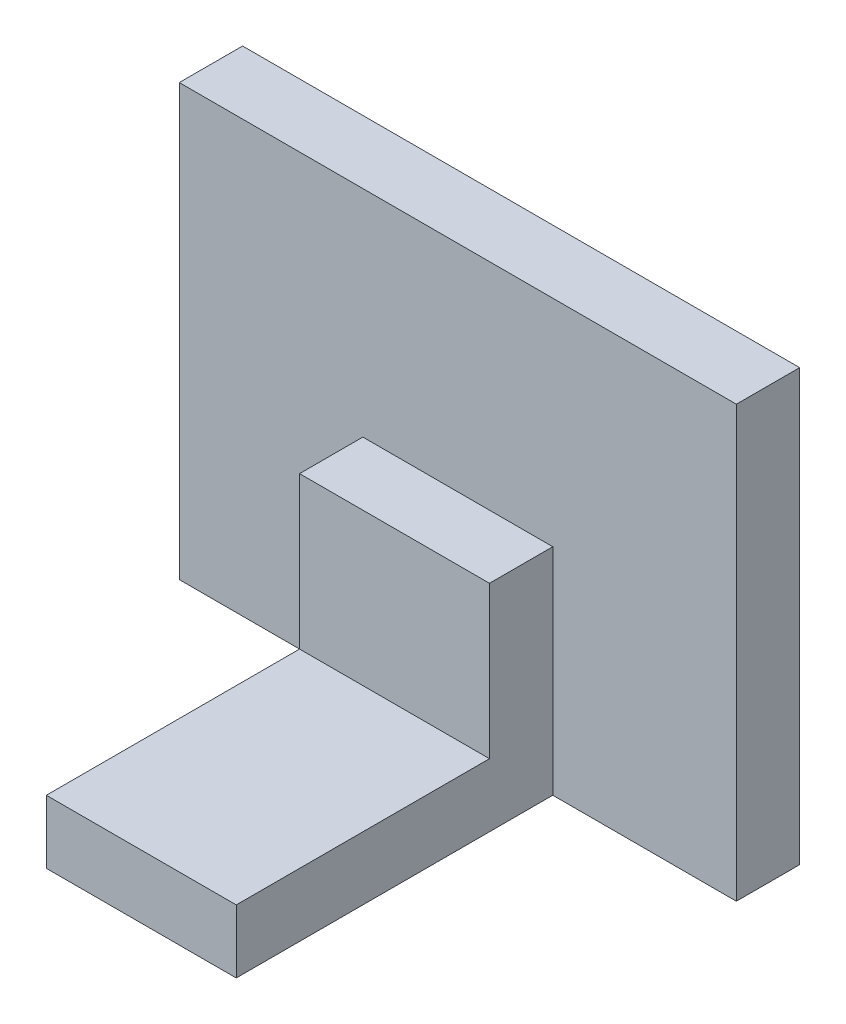
ISO-10303-21;
HEADER;
FILE_DESCRIPTION(('STEP AP214'),'2;1');
FILE_NAME('part.step','',(''),(''),'','','');
FILE_SCHEMA(('AUTOMOTIVE_DESIGN { 1 0 10303 214 1 1 1 1 }'));
ENDSEC;
DATA;
#1=APPLICATION_CONTEXT('core data for automotive mechanical design processes');
#2=APPLICATION_PROTOCOL_DEFINITION('international standard','automotive_design',2000,#1);
#3=PRODUCT_CONTEXT('',#1,'mechanical');
#4=PRODUCT('Part','Part','',(#3));
#5=PRODUCT_RELATED_PRODUCT_CATEGORY('part','',(#4));
#6=PRODUCT_DEFINITION_FORMATION('','',#4);
#7=PRODUCT_DEFINITION_CONTEXT('part definition',#1,'design');
#8=PRODUCT_DEFINITION('design','',#6,#7);
#9=PRODUCT_DEFINITION_SHAPE('','',#8);
#10=(LENGTH_UNIT() NAMED_UNIT(*) SI_UNIT(.MILLI.,.METRE.));
#11=(NAMED_UNIT(*) PLANE_ANGLE_UNIT() SI_UNIT($,.RADIAN.));
#12=(NAMED_UNIT(*) SI_UNIT($,.STERADIAN.) SOLID_ANGLE_UNIT());
#13=UNCERTAINTY_MEASURE_WITH_UNIT(LENGTH_MEASURE(1.E-05),#10,'distance_accuracy_value','');
#14=(GEOMETRIC_REPRESENTATION_CONTEXT(3) GLOBAL_UNCERTAINTY_ASSIGNED_CONTEXT((#13)) GLOBAL_UNIT_ASSIGNED_CONTEXT((#10,
#11,#12)) REPRESENTATION_CONTEXT('',''));
#15=CARTESIAN_POINT('',(0.,0.,0.));
#16=DIRECTION('',(0.,0.,1.));
#17=DIRECTION('',(1.,0.,0.));
#18=AXIS2_PLACEMENT_3D('',#15,#16,#17);
#19=CARTESIAN_POINT('',(0.,0.,0.));
#20=DIRECTION('',(0.,0.,1.));
#21=DIRECTION('',(1.,0.,0.));
#22=AXIS2_PLACEMENT_3D('',#19,#20,#21);
#23=PLANE('',#22);
#24=DIRECTION('',(1.,0.,0.));
#25=VECTOR('',#24,1.);
#26=CARTESIAN_POINT('',(-18.5,-13.,0.));
#27=LINE('',#26,#25);
#28=CARTESIAN_POINT('',(-18.5,-13.,0.));
#29=VERTEX_POINT('',#28);
#30=CARTESIAN_POINT('',(-11.5,-13.,0.));
#31=VERTEX_POINT('',#30);
#32=EDGE_CURVE('E228',#29,#31,#27,.T.);
#33=ORIENTED_EDGE('',*,*,#32,.T.);
#34=DIRECTION('',(0.,1.,0.));
#35=VECTOR('',#34,1.);
#36=CARTESIAN_POINT('',(-11.5,13.,0.));
#37=LINE('',#36,#35);
#38=CARTESIAN_POINT('',(-11.5,13.,0.));
#39=VERTEX_POINT('',#38);
#40=EDGE_CURVE('E168',#31,#39,#37,.T.);
#41=ORIENTED_EDGE('',*,*,#40,.T.);
#42=DIRECTION('',(-1.,0.,0.));
#43=VECTOR('',#42,1.);
#44=CARTESIAN_POINT('',(-18.5,13.,0.));
#45=LINE('',#44,#43);
#46=CARTESIAN_POINT('',(-18.5,13.,0.));
#47=VERTEX_POINT('',#46);
#48=EDGE_CURVE('E216',#39,#47,#45,.T.);
#49=ORIENTED_EDGE('',*,*,#48,.T.);
#50=DIRECTION('',(0.,-1.,0.));
#51=VECTOR('',#50,1.);
#52=CARTESIAN_POINT('',(-18.5,13.,0.));
#53=LINE('',#52,#51);
#54=EDGE_CURVE('E231',#47,#29,#53,.T.);
#55=ORIENTED_EDGE('',*,*,#54,.T.);
#56=EDGE_LOOP('',(#33,#41,#49,#55));
#57=FACE_BOUND('',#56,.T.);
#58=DIRECTION('',(0.,1.,0.));
#59=VECTOR('',#58,1.);
#60=CARTESIAN_POINT('',(22.,17.,0.));
#61=LINE('',#60,#59);
#62=CARTESIAN_POINT('',(22.,-17.,0.));
#63=VERTEX_POINT('',#62);
#64=CARTESIAN_POINT('',(22.,17.,0.));
#65=VERTEX_POINT('',#64);
#66=EDGE_CURVE('E277',#63,#65,#61,.T.);
#67=ORIENTED_EDGE('',*,*,#66,.F.);
#68=DIRECTION('',(1.,0.,0.));
#69=VECTOR('',#68,1.);
#70=CARTESIAN_POINT('',(-22.,-17.,0.));
#71=LINE('',#70,#69);
#72=CARTESIAN_POINT('',(-22.,-17.,0.));
#73=VERTEX_POINT('',#72);
#74=EDGE_CURVE('E282',#73,#63,#71,.T.);
#75=ORIENTED_EDGE('',*,*,#74,.F.);
#76=DIRECTION('',(0.,-1.,0.));
#77=VECTOR('',#76,1.);
#78=CARTESIAN_POINT('',(-22.,17.,0.));
#79=LINE('',#78,#77);
#80=CARTESIAN_POINT('',(-22.,17.,0.));
#81=VERTEX_POINT('',#80);
#82=EDGE_CURVE('E294',#81,#73,#79,.T.);
#83=ORIENTED_EDGE('',*,*,#82,.F.);
#84=DIRECTION('',(-1.,0.,0.));
#85=VECTOR('',#84,1.);
#86=CARTESIAN_POINT('',(-22.,17.,0.));
#87=LINE('',#86,#85);
#88=EDGE_CURVE('E292',#65,#81,#87,.T.);
#89=ORIENTED_EDGE('',*,*,#88,.F.);
#90=EDGE_LOOP('',(#67,#75,#83,#89));
#91=FACE_BOUND('',#90,.T.);
#92=DIRECTION('',(0.,1.,0.));
#93=VECTOR('',#92,1.);
#94=CARTESIAN_POINT('',(11.5,13.,0.));
#95=LINE('',#94,#93);
#96=CARTESIAN_POINT('',(11.5,-13.,0.));
#97=VERTEX_POINT('',#96);
#98=CARTESIAN_POINT('',(11.5,13.,0.));
#99=VERTEX_POINT('',#98);
#100=EDGE_CURVE('E244',#97,#99,#95,.T.);
#101=ORIENTED_EDGE('',*,*,#100,.F.);
#102=DIRECTION('',(-1.,0.,0.));
#103=VECTOR('',#102,1.);
#104=CARTESIAN_POINT('',(18.5,-13.,0.));
#105=LINE('',#104,#103);
#106=CARTESIAN_POINT('',(18.5,-13.,0.));
#107=VERTEX_POINT('',#106);
#108=EDGE_CURVE('E249',#107,#97,#105,.T.);
#109=ORIENTED_EDGE('',*,*,#108,.F.);
#110=DIRECTION('',(0.,-1.,0.));
#111=VECTOR('',#110,1.);
#112=CARTESIAN_POINT('',(18.5,13.,0.));
#113=LINE('',#112,#111);
#114=CARTESIAN_POINT('',(18.5,13.,0.));
#115=VERTEX_POINT('',#114);
#116=EDGE_CURVE('E261',#115,#107,#113,.T.);
#117=ORIENTED_EDGE('',*,*,#116,.F.);
#118=DIRECTION('',(1.,0.,0.));
#119=VECTOR('',#118,1.);
#120=CARTESIAN_POINT('',(18.5,13.,0.));
#121=LINE('',#120,#119);
#122=EDGE_CURVE('E258',#99,#115,#121,.T.);
#123=ORIENTED_EDGE('',*,*,#122,.F.);
#124=EDGE_LOOP('',(#101,#109,#117,#123));
#125=FACE_BOUND('',#124,.T.);
#126=ADVANCED_FACE('F34',(#57,#91,#125),#23,.F.);
#127=CARTESIAN_POINT('',(22.,17.,5.));
#128=DIRECTION('',(-1.,0.,0.));
#129=DIRECTION('',(0.,0.,1.));
#130=AXIS2_PLACEMENT_3D('',#127,#128,#129);
#131=PLANE('',#130);
#132=ORIENTED_EDGE('',*,*,#66,.T.);
#133=DIRECTION('',(0.,0.,-1.));
#134=VECTOR('',#133,1.);
#135=CARTESIAN_POINT('',(22.,17.,5.));
#136=LINE('',#135,#134);
#137=CARTESIAN_POINT('',(22.,17.,5.));
#138=VERTEX_POINT('',#137);
#139=EDGE_CURVE('E11',#138,#65,#136,.T.);
#140=ORIENTED_EDGE('',*,*,#139,.F.);
#141=DIRECTION('',(0.,1.,0.));
#142=VECTOR('',#141,1.);
#143=CARTESIAN_POINT('',(22.,17.,5.));
#144=LINE('',#143,#142);
#145=CARTESIAN_POINT('',(22.,-17.,5.));
#146=VERTEX_POINT('',#145);
#147=EDGE_CURVE('E278',#146,#138,#144,.T.);
#148=ORIENTED_EDGE('',*,*,#147,.F.);
#149=DIRECTION('',(0.,0.,-1.));
#150=VECTOR('',#149,1.);
#151=CARTESIAN_POINT('',(22.,-17.,5.));
#152=LINE('',#151,#150);
#153=EDGE_CURVE('E289',#146,#63,#152,.T.);
#154=ORIENTED_EDGE('',*,*,#153,.T.);
#155=EDGE_LOOP('',(#132,#140,#148,#154));
#156=FACE_BOUND('',#155,.T.);
#157=ADVANCED_FACE('F36',(#156),#131,.F.);
#158=CARTESIAN_POINT('',(-22.,17.,5.));
#159=DIRECTION('',(0.,-1.,0.));
#160=DIRECTION('',(0.,0.,-1.));
#161=AXIS2_PLACEMENT_3D('',#158,#159,#160);
#162=PLANE('',#161);
#163=ORIENTED_EDGE('',*,*,#88,.T.);
#164=DIRECTION('',(0.,0.,-1.));
#165=VECTOR('',#164,1.);
#166=CARTESIAN_POINT('',(-22.,17.,5.));
#167=LINE('',#166,#165);
#168=CARTESIAN_POINT('',(-22.,17.,5.));
#169=VERTEX_POINT('',#168);
#170=EDGE_CURVE('E42',#169,#81,#167,.T.);
#171=ORIENTED_EDGE('',*,*,#170,.F.);
#172=DIRECTION('',(-1.,0.,0.));
#173=VECTOR('',#172,1.);
#174=CARTESIAN_POINT('',(-22.,17.,5.));
#175=LINE('',#174,#173);
#176=EDGE_CURVE('E281',#138,#169,#175,.T.);
#177=ORIENTED_EDGE('',*,*,#176,.F.);
#178=ORIENTED_EDGE('',*,*,#139,.T.);
#179=EDGE_LOOP('',(#163,#171,#177,#178));
#180=FACE_BOUND('',#179,.T.);
#181=ADVANCED_FACE('F344',(#180),#162,.F.);
#182=CARTESIAN_POINT('',(-22.,17.,5.));
#183=DIRECTION('',(1.,0.,0.));
#184=DIRECTION('',(0.,0.,-1.));
#185=AXIS2_PLACEMENT_3D('',#182,#183,#184);
#186=PLANE('',#185);
#187=ORIENTED_EDGE('',*,*,#82,.T.);
#188=DIRECTION('',(0.,0.,-1.));
#189=VECTOR('',#188,1.);
#190=CARTESIAN_POINT('',(-22.,-17.,5.));
#191=LINE('',#190,#189);
#192=CARTESIAN_POINT('',(-22.,-17.,5.));
#193=VERTEX_POINT('',#192);
#194=EDGE_CURVE('E299',#193,#73,#191,.T.);
#195=ORIENTED_EDGE('',*,*,#194,.F.);
#196=DIRECTION('',(0.,-1.,0.));
#197=VECTOR('',#196,1.);
#198=CARTESIAN_POINT('',(-22.,17.,5.));
#199=LINE('',#198,#197);
#200=EDGE_CURVE('E284',#169,#193,#199,.T.);
#201=ORIENTED_EDGE('',*,*,#200,.F.);
#202=ORIENTED_EDGE('',*,*,#170,.T.);
#203=EDGE_LOOP('',(#187,#195,#201,#202));
#204=FACE_BOUND('',#203,.T.);
#205=ADVANCED_FACE('F306',(#204),#186,.F.);
#206=CARTESIAN_POINT('',(-22.,-17.,5.));
#207=DIRECTION('',(0.,1.,0.));
#208=DIRECTION('',(0.,0.,1.));
#209=AXIS2_PLACEMENT_3D('',#206,#207,#208);
#210=PLANE('',#209);
#211=ORIENTED_EDGE('',*,*,#74,.T.);
#212=ORIENTED_EDGE('',*,*,#153,.F.);
#213=DIRECTION('',(1.,0.,0.));
#214=VECTOR('',#213,1.);
#215=CARTESIAN_POINT('',(-22.,-17.,5.));
#216=LINE('',#215,#214);
#217=CARTESIAN_POINT('',(7.5,-17.,5.));
#218=VERTEX_POINT('',#217);
#219=EDGE_CURVE('E286',#218,#146,#216,.T.);
#220=ORIENTED_EDGE('',*,*,#219,.F.);
#221=DIRECTION('',(0.,0.,-1.));
#222=VECTOR('',#221,1.);
#223=CARTESIAN_POINT('',(7.5,-17.,10.));
#224=LINE('',#223,#222);
#225=CARTESIAN_POINT('',(7.5,-17.,30.));
#226=VERTEX_POINT('',#225);
#227=EDGE_CURVE('E169',#226,#218,#224,.T.);
#228=ORIENTED_EDGE('',*,*,#227,.F.);
#229=DIRECTION('',(1.,0.,0.));
#230=VECTOR('',#229,1.);
#231=CARTESIAN_POINT('',(-7.5,-17.,30.));
#232=LINE('',#231,#230);
#233=CARTESIAN_POINT('',(-7.5,-17.,30.));
#234=VERTEX_POINT('',#233);
#235=EDGE_CURVE('E172',#234,#226,#232,.T.);
#236=ORIENTED_EDGE('',*,*,#235,.F.);
#237=DIRECTION('',(0.,0.,-1.));
#238=VECTOR('',#237,1.);
#239=CARTESIAN_POINT('',(-7.5,-17.,10.));
#240=LINE('',#239,#238);
#241=CARTESIAN_POINT('',(-7.5,-17.,5.));
#242=VERTEX_POINT('',#241);
#243=EDGE_CURVE('E159',#234,#242,#240,.T.);
#244=ORIENTED_EDGE('',*,*,#243,.T.);
#245=EDGE_CURVE('E287',#193,#242,#216,.T.);
#246=ORIENTED_EDGE('',*,*,#245,.F.);
#247=ORIENTED_EDGE('',*,*,#194,.T.);
#248=EDGE_LOOP('',(#211,#212,#220,#228,#236,#244,#246,#247));
#249=FACE_BOUND('',#248,.T.);
#250=ADVANCED_FACE('F173',(#249),#210,.F.);
#251=CARTESIAN_POINT('',(0.,0.,5.));
#252=DIRECTION('',(0.,0.,1.));
#253=DIRECTION('',(1.,0.,0.));
#254=AXIS2_PLACEMENT_3D('',#251,#252,#253);
#255=PLANE('',#254);
#256=DIRECTION('',(0.,-1.,0.));
#257=VECTOR('',#256,1.);
#258=CARTESIAN_POINT('',(-7.5,0.,5.));
#259=LINE('',#258,#257);
#260=CARTESIAN_POINT('',(-7.5,0.,5.));
#261=VERTEX_POINT('',#260);
#262=EDGE_CURVE('E57',#261,#242,#259,.T.);
#263=ORIENTED_EDGE('',*,*,#262,.F.);
#264=DIRECTION('',(-1.,0.,0.));
#265=VECTOR('',#264,1.);
#266=CARTESIAN_POINT('',(-7.5,0.,5.));
#267=LINE('',#266,#265);
#268=CARTESIAN_POINT('',(7.5,0.,5.));
#269=VERTEX_POINT('',#268);
#270=EDGE_CURVE('E197',#269,#261,#267,.T.);
#271=ORIENTED_EDGE('',*,*,#270,.F.);
#272=DIRECTION('',(0.,1.,0.));
#273=VECTOR('',#272,1.);
#274=CARTESIAN_POINT('',(7.5,0.,5.));
#275=LINE('',#274,#273);
#276=EDGE_CURVE('E203',#218,#269,#275,.T.);
#277=ORIENTED_EDGE('',*,*,#276,.F.);
#278=ORIENTED_EDGE('',*,*,#219,.T.);
#279=ORIENTED_EDGE('',*,*,#147,.T.);
#280=ORIENTED_EDGE('',*,*,#176,.T.);
#281=ORIENTED_EDGE('',*,*,#200,.T.);
#282=ORIENTED_EDGE('',*,*,#245,.T.);
#283=EDGE_LOOP('',(#263,#271,#277,#278,#279,#280,#281,#282));
#284=FACE_BOUND('',#283,.T.);
#285=ADVANCED_FACE('F317',(#284),#255,.T.);
#286=CARTESIAN_POINT('',(11.5,13.,-1.));
#287=DIRECTION('',(1.,0.,0.));
#288=DIRECTION('',(0.,1.,0.));
#289=AXIS2_PLACEMENT_3D('',#286,#287,#288);
#290=PLANE('',#289);
#291=ORIENTED_EDGE('',*,*,#100,.T.);
#292=DIRECTION('',(0.,0.,1.));
#293=VECTOR('',#292,1.);
#294=CARTESIAN_POINT('',(11.5,13.,-1.));
#295=LINE('',#294,#293);
#296=CARTESIAN_POINT('',(11.5,13.,-1.));
#297=VERTEX_POINT('',#296);
#298=EDGE_CURVE('E274',#297,#99,#295,.T.);
#299=ORIENTED_EDGE('',*,*,#298,.F.);
#300=DIRECTION('',(0.,1.,0.));
#301=VECTOR('',#300,1.);
#302=CARTESIAN_POINT('',(11.5,13.,-1.));
#303=LINE('',#302,#301);
#304=CARTESIAN_POINT('',(11.5,-13.,-1.));
#305=VERTEX_POINT('',#304);
#306=EDGE_CURVE('E245',#305,#297,#303,.T.);
#307=ORIENTED_EDGE('',*,*,#306,.F.);
#308=DIRECTION('',(0.,0.,1.));
#309=VECTOR('',#308,1.);
#310=CARTESIAN_POINT('',(11.5,-13.,-1.));
#311=LINE('',#310,#309);
#312=EDGE_CURVE('E255',#305,#97,#311,.T.);
#313=ORIENTED_EDGE('',*,*,#312,.T.);
#314=EDGE_LOOP('',(#291,#299,#307,#313));
#315=FACE_BOUND('',#314,.T.);
#316=ADVANCED_FACE('F372',(#315),#290,.F.);
#317=CARTESIAN_POINT('',(18.5,13.,-1.));
#318=DIRECTION('',(0.,-1.,0.));
#319=DIRECTION('',(1.,0.,0.));
#320=AXIS2_PLACEMENT_3D('',#317,#318,#319);
#321=PLANE('',#320);
#322=ORIENTED_EDGE('',*,*,#122,.T.);
#323=DIRECTION('',(0.,0.,1.));
#324=VECTOR('',#323,1.);
#325=CARTESIAN_POINT('',(18.5,13.,-1.));
#326=LINE('',#325,#324);
#327=CARTESIAN_POINT('',(18.5,13.,-1.));
#328=VERTEX_POINT('',#327);
#329=EDGE_CURVE('E271',#328,#115,#326,.T.);
#330=ORIENTED_EDGE('',*,*,#329,.F.);
#331=DIRECTION('',(1.,0.,0.));
#332=VECTOR('',#331,1.);
#333=CARTESIAN_POINT('',(18.5,13.,-1.));
#334=LINE('',#333,#332);
#335=EDGE_CURVE('E248',#297,#328,#334,.T.);
#336=ORIENTED_EDGE('',*,*,#335,.F.);
#337=ORIENTED_EDGE('',*,*,#298,.T.);
#338=EDGE_LOOP('',(#322,#330,#336,#337));
#339=FACE_BOUND('',#338,.T.);
#340=ADVANCED_FACE('F378',(#339),#321,.F.);
#341=CARTESIAN_POINT('',(18.5,13.,-1.));
#342=DIRECTION('',(-1.,0.,0.));
#343=DIRECTION('',(0.,-1.,0.));
#344=AXIS2_PLACEMENT_3D('',#341,#342,#343);
#345=PLANE('',#344);
#346=ORIENTED_EDGE('',*,*,#116,.T.);
#347=DIRECTION('',(0.,0.,1.));
#348=VECTOR('',#347,1.);
#349=CARTESIAN_POINT('',(18.5,-13.,-1.));
#350=LINE('',#349,#348);
#351=CARTESIAN_POINT('',(18.5,-13.,-1.));
#352=VERTEX_POINT('',#351);
#353=EDGE_CURVE('E268',#352,#107,#350,.T.);
#354=ORIENTED_EDGE('',*,*,#353,.F.);
#355=DIRECTION('',(0.,-1.,0.));
#356=VECTOR('',#355,1.);
#357=CARTESIAN_POINT('',(18.5,13.,-1.));
#358=LINE('',#357,#356);
#359=EDGE_CURVE('E251',#328,#352,#358,.T.);
#360=ORIENTED_EDGE('',*,*,#359,.F.);
#361=ORIENTED_EDGE('',*,*,#329,.T.);
#362=EDGE_LOOP('',(#346,#354,#360,#361));
#363=FACE_BOUND('',#362,.T.);
#364=ADVANCED_FACE('F385',(#363),#345,.F.);
#365=CARTESIAN_POINT('',(18.5,-13.,-1.));
#366=DIRECTION('',(0.,1.,0.));
#367=DIRECTION('',(0.,0.,1.));
#368=AXIS2_PLACEMENT_3D('',#365,#366,#367);
#369=PLANE('',#368);
#370=ORIENTED_EDGE('',*,*,#108,.T.);
#371=ORIENTED_EDGE('',*,*,#312,.F.);
#372=DIRECTION('',(-1.,0.,0.));
#373=VECTOR('',#372,1.);
#374=CARTESIAN_POINT('',(18.5,-13.,-1.));
#375=LINE('',#374,#373);
#376=EDGE_CURVE('E253',#352,#305,#375,.T.);
#377=ORIENTED_EDGE('',*,*,#376,.F.);
#378=ORIENTED_EDGE('',*,*,#353,.T.);
#379=EDGE_LOOP('',(#370,#371,#377,#378));
#380=FACE_BOUND('',#379,.T.);
#381=ADVANCED_FACE('F393',(#380),#369,.F.);
#382=CARTESIAN_POINT('',(0.,0.,-1.));
#383=DIRECTION('',(0.,0.,-1.));
#384=DIRECTION('',(-1.,0.,0.));
#385=AXIS2_PLACEMENT_3D('',#382,#383,#384);
#386=PLANE('',#385);
#387=ORIENTED_EDGE('',*,*,#306,.T.);
#388=ORIENTED_EDGE('',*,*,#335,.T.);
#389=ORIENTED_EDGE('',*,*,#359,.T.);
#390=ORIENTED_EDGE('',*,*,#376,.T.);
#391=EDGE_LOOP('',(#387,#388,#389,#390));
#392=FACE_BOUND('',#391,.T.);
#393=ADVANCED_FACE('F401',(#392),#386,.T.);
#394=CARTESIAN_POINT('',(-11.5,13.,-1.));
#395=DIRECTION('',(1.,0.,0.));
#396=DIRECTION('',(0.,1.,0.));
#397=AXIS2_PLACEMENT_3D('',#394,#395,#396);
#398=PLANE('',#397);
#399=ORIENTED_EDGE('',*,*,#40,.F.);
#400=DIRECTION('',(0.,0.,1.));
#401=VECTOR('',#400,1.);
#402=CARTESIAN_POINT('',(-11.5,-13.,-1.));
#403=LINE('',#402,#401);
#404=CARTESIAN_POINT('',(-11.5,-13.,-1.));
#405=VERTEX_POINT('',#404);
#406=EDGE_CURVE('E242',#405,#31,#403,.T.);
#407=ORIENTED_EDGE('',*,*,#406,.F.);
#408=DIRECTION('',(0.,1.,0.));
#409=VECTOR('',#408,1.);
#410=CARTESIAN_POINT('',(-11.5,13.,-1.));
#411=LINE('',#410,#409);
#412=CARTESIAN_POINT('',(-11.5,13.,-1.));
#413=VERTEX_POINT('',#412);
#414=EDGE_CURVE('E212',#405,#413,#411,.T.);
#415=ORIENTED_EDGE('',*,*,#414,.T.);
#416=DIRECTION('',(0.,0.,1.));
#417=VECTOR('',#416,1.);
#418=CARTESIAN_POINT('',(-11.5,13.,-1.));
#419=LINE('',#418,#417);
#420=EDGE_CURVE('E225',#413,#39,#419,.T.);
#421=ORIENTED_EDGE('',*,*,#420,.T.);
#422=EDGE_LOOP('',(#399,#407,#415,#421));
#423=FACE_BOUND('',#422,.T.);
#424=ADVANCED_FACE('F409',(#423),#398,.T.);
#425=CARTESIAN_POINT('',(-18.5,-13.,-1.));
#426=DIRECTION('',(0.,-1.,0.));
#427=DIRECTION('',(0.,0.,-1.));
#428=AXIS2_PLACEMENT_3D('',#425,#426,#427);
#429=PLANE('',#428);
#430=ORIENTED_EDGE('',*,*,#32,.F.);
#431=DIRECTION('',(0.,0.,1.));
#432=VECTOR('',#431,1.);
#433=CARTESIAN_POINT('',(-18.5,-13.,-1.));
#434=LINE('',#433,#432);
#435=CARTESIAN_POINT('',(-18.5,-13.,-1.));
#436=VERTEX_POINT('',#435);
#437=EDGE_CURVE('E240',#436,#29,#434,.T.);
#438=ORIENTED_EDGE('',*,*,#437,.F.);
#439=DIRECTION('',(1.,0.,0.));
#440=VECTOR('',#439,1.);
#441=CARTESIAN_POINT('',(-18.5,-13.,-1.));
#442=LINE('',#441,#440);
#443=EDGE_CURVE('E215',#436,#405,#442,.T.);
#444=ORIENTED_EDGE('',*,*,#443,.T.);
#445=ORIENTED_EDGE('',*,*,#406,.T.);
#446=EDGE_LOOP('',(#430,#438,#444,#445));
#447=FACE_BOUND('',#446,.T.);
#448=ADVANCED_FACE('F417',(#447),#429,.T.);
#449=CARTESIAN_POINT('',(-18.5,13.,-1.));
#450=DIRECTION('',(-1.,0.,0.));
#451=DIRECTION('',(0.,-1.,0.));
#452=AXIS2_PLACEMENT_3D('',#449,#450,#451);
#453=PLANE('',#452);
#454=ORIENTED_EDGE('',*,*,#54,.F.);
#455=DIRECTION('',(0.,0.,1.));
#456=VECTOR('',#455,1.);
#457=CARTESIAN_POINT('',(-18.5,13.,-1.));
#458=LINE('',#457,#456);
#459=CARTESIAN_POINT('',(-18.5,13.,-1.));
#460=VERTEX_POINT('',#459);
#461=EDGE_CURVE('E237',#460,#47,#458,.T.);
#462=ORIENTED_EDGE('',*,*,#461,.F.);
#463=DIRECTION('',(0.,-1.,0.));
#464=VECTOR('',#463,1.);
#465=CARTESIAN_POINT('',(-18.5,13.,-1.));
#466=LINE('',#465,#464);
#467=EDGE_CURVE('E219',#460,#436,#466,.T.);
#468=ORIENTED_EDGE('',*,*,#467,.T.);
#469=ORIENTED_EDGE('',*,*,#437,.T.);
#470=EDGE_LOOP('',(#454,#462,#468,#469));
#471=FACE_BOUND('',#470,.T.);
#472=ADVANCED_FACE('F425',(#471),#453,.T.);
#473=CARTESIAN_POINT('',(-18.5,13.,-1.));
#474=DIRECTION('',(0.,1.,0.));
#475=DIRECTION('',(-1.,0.,0.));
#476=AXIS2_PLACEMENT_3D('',#473,#474,#475);
#477=PLANE('',#476);
#478=ORIENTED_EDGE('',*,*,#48,.F.);
#479=ORIENTED_EDGE('',*,*,#420,.F.);
#480=DIRECTION('',(-1.,0.,0.));
#481=VECTOR('',#480,1.);
#482=CARTESIAN_POINT('',(-18.5,13.,-1.));
#483=LINE('',#482,#481);
#484=EDGE_CURVE('E222',#413,#460,#483,.T.);
#485=ORIENTED_EDGE('',*,*,#484,.T.);
#486=ORIENTED_EDGE('',*,*,#461,.T.);
#487=EDGE_LOOP('',(#478,#479,#485,#486));
#488=FACE_BOUND('',#487,.T.);
#489=ADVANCED_FACE('F433',(#488),#477,.T.);
#490=CARTESIAN_POINT('',(0.,0.,-1.));
#491=DIRECTION('',(0.,0.,-1.));
#492=DIRECTION('',(1.,0.,0.));
#493=AXIS2_PLACEMENT_3D('',#490,#491,#492);
#494=PLANE('',#493);
#495=ORIENTED_EDGE('',*,*,#414,.F.);
#496=ORIENTED_EDGE('',*,*,#443,.F.);
#497=ORIENTED_EDGE('',*,*,#467,.F.);
#498=ORIENTED_EDGE('',*,*,#484,.F.);
#499=EDGE_LOOP('',(#495,#496,#497,#498));
#500=FACE_BOUND('',#499,.T.);
#501=ADVANCED_FACE('F441',(#500),#494,.T.);
#502=CARTESIAN_POINT('',(-7.5,0.,10.));
#503=DIRECTION('',(1.,0.,0.));
#504=DIRECTION('',(0.,1.,0.));
#505=AXIS2_PLACEMENT_3D('',#502,#503,#504);
#506=PLANE('',#505);
#507=ORIENTED_EDGE('',*,*,#262,.T.);
#508=ORIENTED_EDGE('',*,*,#243,.F.);
#509=DIRECTION('',(0.,-1.,0.));
#510=VECTOR('',#509,1.);
#511=CARTESIAN_POINT('',(-7.5,-17.,30.));
#512=LINE('',#511,#510);
#513=CARTESIAN_POINT('',(-7.5,-12.,30.));
#514=VERTEX_POINT('',#513);
#515=EDGE_CURVE('E164',#514,#234,#512,.T.);
#516=ORIENTED_EDGE('',*,*,#515,.F.);
#517=DIRECTION('',(0.,0.,-1.));
#518=VECTOR('',#517,1.);
#519=CARTESIAN_POINT('',(-7.5,-12.,30.));
#520=LINE('',#519,#518);
#521=CARTESIAN_POINT('',(-7.5,-12.,10.));
#522=VERTEX_POINT('',#521);
#523=EDGE_CURVE('E188',#514,#522,#520,.T.);
#524=ORIENTED_EDGE('',*,*,#523,.T.);
#525=DIRECTION('',(0.,-1.,0.));
#526=VECTOR('',#525,1.);
#527=CARTESIAN_POINT('',(-7.5,0.,10.));
#528=LINE('',#527,#526);
#529=CARTESIAN_POINT('',(-7.5,0.,10.));
#530=VERTEX_POINT('',#529);
#531=EDGE_CURVE('E194',#530,#522,#528,.T.);
#532=ORIENTED_EDGE('',*,*,#531,.F.);
#533=DIRECTION('',(0.,0.,-1.));
#534=VECTOR('',#533,1.);
#535=CARTESIAN_POINT('',(-7.5,0.,10.));
#536=LINE('',#535,#534);
#537=EDGE_CURVE('E201',#530,#261,#536,.T.);
#538=ORIENTED_EDGE('',*,*,#537,.T.);
#539=EDGE_LOOP('',(#507,#508,#516,#524,#532,#538));
#540=FACE_BOUND('',#539,.T.);
#541=ADVANCED_FACE('F161',(#540),#506,.F.);
#542=CARTESIAN_POINT('',(7.5,0.,10.));
#543=DIRECTION('',(-1.,0.,0.));
#544=DIRECTION('',(0.,-1.,0.));
#545=AXIS2_PLACEMENT_3D('',#542,#543,#544);
#546=PLANE('',#545);
#547=ORIENTED_EDGE('',*,*,#276,.T.);
#548=DIRECTION('',(0.,0.,-1.));
#549=VECTOR('',#548,1.);
#550=CARTESIAN_POINT('',(7.5,0.,10.));
#551=LINE('',#550,#549);
#552=CARTESIAN_POINT('',(7.5,0.,10.));
#553=VERTEX_POINT('',#552);
#554=EDGE_CURVE('E208',#553,#269,#551,.T.);
#555=ORIENTED_EDGE('',*,*,#554,.F.);
#556=DIRECTION('',(0.,1.,0.));
#557=VECTOR('',#556,1.);
#558=CARTESIAN_POINT('',(7.5,0.,10.));
#559=LINE('',#558,#557);
#560=CARTESIAN_POINT('',(7.5,-12.,10.));
#561=VERTEX_POINT('',#560);
#562=EDGE_CURVE('E196',#561,#553,#559,.T.);
#563=ORIENTED_EDGE('',*,*,#562,.F.);
#564=DIRECTION('',(0.,0.,-1.));
#565=VECTOR('',#564,1.);
#566=CARTESIAN_POINT('',(7.5,-12.,30.));
#567=LINE('',#566,#565);
#568=CARTESIAN_POINT('',(7.5,-12.,30.));
#569=VERTEX_POINT('',#568);
#570=EDGE_CURVE('E191',#569,#561,#567,.T.);
#571=ORIENTED_EDGE('',*,*,#570,.F.);
#572=DIRECTION('',(0.,1.,0.));
#573=VECTOR('',#572,1.);
#574=CARTESIAN_POINT('',(7.5,-17.,30.));
#575=LINE('',#574,#573);
#576=EDGE_CURVE('E178',#226,#569,#575,.T.);
#577=ORIENTED_EDGE('',*,*,#576,.F.);
#578=ORIENTED_EDGE('',*,*,#227,.T.);
#579=EDGE_LOOP('',(#547,#555,#563,#571,#577,#578));
#580=FACE_BOUND('',#579,.T.);
#581=ADVANCED_FACE('F319',(#580),#546,.F.);
#582=CARTESIAN_POINT('',(-7.5,0.,10.));
#583=DIRECTION('',(0.,-1.,0.));
#584=DIRECTION('',(0.,0.,-1.));
#585=AXIS2_PLACEMENT_3D('',#582,#583,#584);
#586=PLANE('',#585);
#587=ORIENTED_EDGE('',*,*,#270,.T.);
#588=ORIENTED_EDGE('',*,*,#537,.F.);
#589=DIRECTION('',(-1.,0.,0.));
#590=VECTOR('',#589,1.);
#591=CARTESIAN_POINT('',(-7.5,0.,10.));
#592=LINE('',#591,#590);
#593=EDGE_CURVE('E199',#553,#530,#592,.T.);
#594=ORIENTED_EDGE('',*,*,#593,.F.);
#595=ORIENTED_EDGE('',*,*,#554,.T.);
#596=EDGE_LOOP('',(#587,#588,#594,#595));
#597=FACE_BOUND('',#596,.T.);
#598=ADVANCED_FACE('F329',(#597),#586,.F.);
#599=CARTESIAN_POINT('',(0.,0.,10.));
#600=DIRECTION('',(0.,0.,1.));
#601=DIRECTION('',(1.,0.,0.));
#602=AXIS2_PLACEMENT_3D('',#599,#600,#601);
#603=PLANE('',#602);
#604=DIRECTION('',(-1.,0.,0.));
#605=VECTOR('',#604,1.);
#606=CARTESIAN_POINT('',(-7.5,-12.,10.));
#607=LINE('',#606,#605);
#608=EDGE_CURVE('E49',#561,#522,#607,.T.);
#609=ORIENTED_EDGE('',*,*,#608,.F.);
#610=ORIENTED_EDGE('',*,*,#562,.T.);
#611=ORIENTED_EDGE('',*,*,#593,.T.);
#612=ORIENTED_EDGE('',*,*,#531,.T.);
#613=EDGE_LOOP('',(#609,#610,#611,#612));
#614=FACE_BOUND('',#613,.T.);
#615=ADVANCED_FACE('F326',(#614),#603,.T.);
#616=CARTESIAN_POINT('',(-7.5,-12.,30.));
#617=DIRECTION('',(0.,-1.,0.));
#618=DIRECTION('',(0.,0.,-1.));
#619=AXIS2_PLACEMENT_3D('',#616,#617,#618);
#620=PLANE('',#619);
#621=ORIENTED_EDGE('',*,*,#608,.T.);
#622=ORIENTED_EDGE('',*,*,#523,.F.);
#623=DIRECTION('',(-1.,0.,0.));
#624=VECTOR('',#623,1.);
#625=CARTESIAN_POINT('',(-7.5,-12.,30.));
#626=LINE('',#625,#624);
#627=EDGE_CURVE('E182',#569,#514,#626,.T.);
#628=ORIENTED_EDGE('',*,*,#627,.F.);
#629=ORIENTED_EDGE('',*,*,#570,.T.);
#630=EDGE_LOOP('',(#621,#622,#628,#629));
#631=FACE_BOUND('',#630,.T.);
#632=ADVANCED_FACE('F323',(#631),#620,.F.);
#633=CARTESIAN_POINT('',(0.,0.,30.));
#634=DIRECTION('',(0.,0.,-1.));
#635=DIRECTION('',(-1.,0.,0.));
#636=AXIS2_PLACEMENT_3D('',#633,#634,#635);
#637=PLANE('',#636);
#638=ORIENTED_EDGE('',*,*,#515,.T.);
#639=ORIENTED_EDGE('',*,*,#235,.T.);
#640=ORIENTED_EDGE('',*,*,#576,.T.);
#641=ORIENTED_EDGE('',*,*,#627,.T.);
#642=EDGE_LOOP('',(#638,#639,#640,#641));
#643=FACE_BOUND('',#642,.T.);
#644=ADVANCED_FACE('F180',(#643),#637,.F.);
#645=CLOSED_SHELL('',(#126,#157,#181,#205,#250,#285,#316,#340,#364,#381,#393,#424,#448,#472,
#489,#501,#541,#581,#598,#615,#632,#644));
#646=MANIFOLD_SOLID_BREP('B2',#645);
#647=ADVANCED_BREP_SHAPE_REPRESENTATION('',(#18,#646),#14);
#648=SHAPE_DEFINITION_REPRESENTATION(#9,#647);
ENDSEC;
END-ISO-10303-21;
